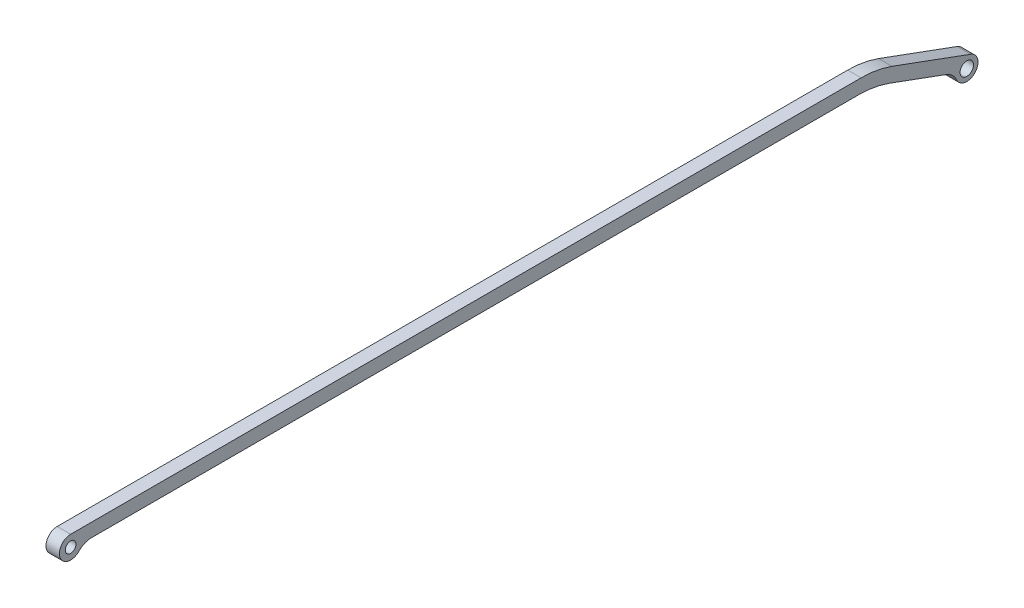
ISO-10303-21;
HEADER;
FILE_DESCRIPTION(('STEP AP214'),'2;1');
FILE_NAME('part.step','',(''),(''),'','','');
FILE_SCHEMA(('AUTOMOTIVE_DESIGN { 1 0 10303 214 1 1 1 1 }'));
ENDSEC;
DATA;
#1=APPLICATION_CONTEXT('core data for automotive mechanical design processes');
#2=APPLICATION_PROTOCOL_DEFINITION('international standard','automotive_design',2000,#1);
#3=PRODUCT_CONTEXT('',#1,'mechanical');
#4=PRODUCT('Part','Part','',(#3));
#5=PRODUCT_RELATED_PRODUCT_CATEGORY('part','',(#4));
#6=PRODUCT_DEFINITION_FORMATION('','',#4);
#7=PRODUCT_DEFINITION_CONTEXT('part definition',#1,'design');
#8=PRODUCT_DEFINITION('design','',#6,#7);
#9=PRODUCT_DEFINITION_SHAPE('','',#8);
#10=(LENGTH_UNIT() NAMED_UNIT(*) SI_UNIT(.MILLI.,.METRE.));
#11=(NAMED_UNIT(*) PLANE_ANGLE_UNIT() SI_UNIT($,.RADIAN.));
#12=(NAMED_UNIT(*) SI_UNIT($,.STERADIAN.) SOLID_ANGLE_UNIT());
#13=UNCERTAINTY_MEASURE_WITH_UNIT(LENGTH_MEASURE(1.E-05),#10,'distance_accuracy_value','');
#14=(GEOMETRIC_REPRESENTATION_CONTEXT(3) GLOBAL_UNCERTAINTY_ASSIGNED_CONTEXT((#13)) GLOBAL_UNIT_ASSIGNED_CONTEXT((#10,
#11,#12)) REPRESENTATION_CONTEXT('',''));
#15=CARTESIAN_POINT('',(0.,0.,0.));
#16=DIRECTION('',(0.,0.,1.));
#17=DIRECTION('',(1.,0.,0.));
#18=AXIS2_PLACEMENT_3D('',#15,#16,#17);
#19=CARTESIAN_POINT('',(1.5,-0.25,99.9296627633657));
#20=DIRECTION('',(1.,0.,0.));
#21=DIRECTION('',(0.,0.,-1.));
#22=AXIS2_PLACEMENT_3D('',#19,#20,#21);
#23=PLANE('',#22);
#24=CARTESIAN_POINT('',(1.5,-0.25,99.9296627633657));
#25=DIRECTION('',(1.,0.,0.));
#26=DIRECTION('',(0.,0.,-1.));
#27=AXIS2_PLACEMENT_3D('',#24,#25,#26);
#28=CIRCLE('',#27,0.600000000000007);
#29=CARTESIAN_POINT('',(1.5,-0.25,99.3296627633657));
#30=VERTEX_POINT('',#29);
#31=EDGE_CURVE('E146',#30,#30,#28,.T.);
#32=ORIENTED_EDGE('',*,*,#31,.F.);
#33=EDGE_LOOP('',(#32));
#34=FACE_BOUND('',#33,.T.);
#35=CARTESIAN_POINT('',(1.5,-0.25,99.9296627633657));
#36=DIRECTION('',(1.,0.,0.));
#37=DIRECTION('',(0.,0.,-1.));
#38=AXIS2_PLACEMENT_3D('',#35,#36,#37);
#39=CIRCLE('',#38,1.25);
#40=CARTESIAN_POINT('',(1.5,1.,99.9296627633657));
#41=VERTEX_POINT('',#40);
#42=CARTESIAN_POINT('',(1.5,-1.11538461538462,99.0276597326304));
#43=VERTEX_POINT('',#42);
#44=EDGE_CURVE('E161',#41,#43,#39,.T.);
#45=ORIENTED_EDGE('',*,*,#44,.T.);
#46=CARTESIAN_POINT('',(1.5,-2.5,97.584454883454));
#47=DIRECTION('',(-1.,0.,0.));
#48=DIRECTION('',(0.,0.,1.));
#49=AXIS2_PLACEMENT_3D('',#46,#47,#48);
#50=CIRCLE('',#49,2.);
#51=CARTESIAN_POINT('',(1.5,-0.5,97.584454883454));
#52=VERTEX_POINT('',#51);
#53=EDGE_CURVE('E99',#43,#52,#50,.T.);
#54=ORIENTED_EDGE('',*,*,#53,.T.);
#55=DIRECTION('',(0.,0.,-1.));
#56=VECTOR('',#55,1.);
#57=CARTESIAN_POINT('',(1.5,-0.5,97.584454883454));
#58=LINE('',#57,#56);
#59=CARTESIAN_POINT('',(1.5,-0.499999999999999,12.0428471598259));
#60=VERTEX_POINT('',#59);
#61=EDGE_CURVE('E182',#52,#60,#58,.T.);
#62=ORIENTED_EDGE('',*,*,#61,.T.);
#63=CARTESIAN_POINT('',(1.5,-10.5,12.0428471598259));
#64=DIRECTION('',(-1.,0.,0.));
#65=DIRECTION('',(0.,0.,-1.));
#66=AXIS2_PLACEMENT_3D('',#63,#64,#65);
#67=CIRCLE('',#66,10.);
#68=CARTESIAN_POINT('',(1.5,-1.11180558268441,8.59874995116809));
#69=VERTEX_POINT('',#68);
#70=EDGE_CURVE('E201',#60,#69,#67,.T.);
#71=ORIENTED_EDGE('',*,*,#70,.T.);
#72=DIRECTION('',(0.,-0.344409720865779,-0.938819441731559));
#73=VECTOR('',#72,1.);
#74=CARTESIAN_POINT('',(1.5,-3.42699246914028,2.28782918277961));
#75=LINE('',#74,#73);
#76=CARTESIAN_POINT('',(1.5,-3.42699246914028,2.28782918277961));
#77=VERTEX_POINT('',#76);
#78=EDGE_CURVE('E198',#69,#77,#75,.T.);
#79=ORIENTED_EDGE('',*,*,#78,.T.);
#80=CARTESIAN_POINT('',(1.5,-5.3046313526034,2.97664862451117));
#81=DIRECTION('',(-1.,0.,0.));
#82=DIRECTION('',(0.,0.,-1.));
#83=AXIS2_PLACEMENT_3D('',#80,#81,#82);
#84=CIRCLE('',#83,2.);
#85=CARTESIAN_POINT('',(1.5,-4.50178128946284,1.14486485558122));
#86=VERTEX_POINT('',#85);
#87=EDGE_CURVE('E200',#77,#86,#84,.T.);
#88=ORIENTED_EDGE('',*,*,#87,.T.);
#89=CARTESIAN_POINT('',(1.5,-4.,0.));
#90=DIRECTION('',(1.,0.,0.));
#91=DIRECTION('',(0.,0.,-1.));
#92=AXIS2_PLACEMENT_3D('',#89,#90,#91);
#93=CIRCLE('',#92,1.25);
#94=CARTESIAN_POINT('',(1.5,-2.82647569783555,-0.430512151082224));
#95=VERTEX_POINT('',#94);
#96=EDGE_CURVE('E124',#86,#95,#93,.T.);
#97=ORIENTED_EDGE('',*,*,#96,.T.);
#98=DIRECTION('',(0.,0.34440972086578,0.938819441731559));
#99=VECTOR('',#98,1.);
#100=CARTESIAN_POINT('',(1.5,0.38819441731559,8.33229162597338));
#101=LINE('',#100,#99);
#102=CARTESIAN_POINT('',(1.5,0.38819441731559,8.33229162597338));
#103=VERTEX_POINT('',#102);
#104=EDGE_CURVE('E118',#95,#103,#101,.T.);
#105=ORIENTED_EDGE('',*,*,#104,.T.);
#106=CARTESIAN_POINT('',(1.5,-9.,11.7763888346312));
#107=DIRECTION('',(1.,0.,0.));
#108=DIRECTION('',(0.,0.,-1.));
#109=AXIS2_PLACEMENT_3D('',#106,#107,#108);
#110=CIRCLE('',#109,10.);
#111=CARTESIAN_POINT('',(1.5,0.999999999999999,11.7763888346312));
#112=VERTEX_POINT('',#111);
#113=EDGE_CURVE('E122',#103,#112,#110,.T.);
#114=ORIENTED_EDGE('',*,*,#113,.T.);
#115=DIRECTION('',(0.,0.,1.));
#116=VECTOR('',#115,1.);
#117=CARTESIAN_POINT('',(1.5,1.,99.9296627633657));
#118=LINE('',#117,#116);
#119=EDGE_CURVE('E50',#112,#41,#118,.T.);
#120=ORIENTED_EDGE('',*,*,#119,.T.);
#121=EDGE_LOOP('',(#45,#54,#62,#71,#79,#88,#97,#105,#114,#120));
#122=FACE_BOUND('',#121,.T.);
#123=CARTESIAN_POINT('',(1.5,-4.,0.));
#124=DIRECTION('',(1.,0.,0.));
#125=DIRECTION('',(0.,0.,-1.));
#126=AXIS2_PLACEMENT_3D('',#123,#124,#125);
#127=CIRCLE('',#126,0.750000000000002);
#128=CARTESIAN_POINT('',(1.5,-4.,-0.750000000000002));
#129=VERTEX_POINT('',#128);
#130=EDGE_CURVE('E212',#129,#129,#127,.T.);
#131=ORIENTED_EDGE('',*,*,#130,.F.);
#132=EDGE_LOOP('',(#131));
#133=FACE_BOUND('',#132,.T.);
#134=ADVANCED_FACE('F33',(#34,#122,#133),#23,.T.);
#135=CARTESIAN_POINT('',(0.,-0.25,99.9296627633657));
#136=DIRECTION('',(1.,0.,0.));
#137=DIRECTION('',(0.,0.,-1.));
#138=AXIS2_PLACEMENT_3D('',#135,#136,#137);
#139=PLANE('',#138);
#140=CARTESIAN_POINT('',(0.,-0.25,99.9296627633657));
#141=DIRECTION('',(1.,0.,0.));
#142=DIRECTION('',(0.,0.,-1.));
#143=AXIS2_PLACEMENT_3D('',#140,#141,#142);
#144=CIRCLE('',#143,0.600000000000007);
#145=CARTESIAN_POINT('',(0.,-0.25,99.3296627633657));
#146=VERTEX_POINT('',#145);
#147=EDGE_CURVE('E209',#146,#146,#144,.T.);
#148=ORIENTED_EDGE('',*,*,#147,.T.);
#149=EDGE_LOOP('',(#148));
#150=FACE_BOUND('',#149,.T.);
#151=CARTESIAN_POINT('',(0.,-0.25,99.9296627633657));
#152=DIRECTION('',(1.,0.,0.));
#153=DIRECTION('',(0.,0.,-1.));
#154=AXIS2_PLACEMENT_3D('',#151,#152,#153);
#155=CIRCLE('',#154,1.25);
#156=CARTESIAN_POINT('',(0.,1.,99.9296627633657));
#157=VERTEX_POINT('',#156);
#158=CARTESIAN_POINT('',(0.,-1.11538461538462,99.0276597326304));
#159=VERTEX_POINT('',#158);
#160=EDGE_CURVE('E142',#157,#159,#155,.T.);
#161=ORIENTED_EDGE('',*,*,#160,.F.);
#162=DIRECTION('',(0.,0.,1.));
#163=VECTOR('',#162,1.);
#164=CARTESIAN_POINT('',(0.,1.,99.9296627633657));
#165=LINE('',#164,#163);
#166=CARTESIAN_POINT('',(0.,0.999999999999999,11.7763888346312));
#167=VERTEX_POINT('',#166);
#168=EDGE_CURVE('E91',#167,#157,#165,.T.);
#169=ORIENTED_EDGE('',*,*,#168,.F.);
#170=CARTESIAN_POINT('',(0.,-9.,11.7763888346312));
#171=DIRECTION('',(1.,0.,0.));
#172=DIRECTION('',(0.,0.,-1.));
#173=AXIS2_PLACEMENT_3D('',#170,#171,#172);
#174=CIRCLE('',#173,10.);
#175=CARTESIAN_POINT('',(0.,0.38819441731559,8.33229162597338));
#176=VERTEX_POINT('',#175);
#177=EDGE_CURVE('E85',#176,#167,#174,.T.);
#178=ORIENTED_EDGE('',*,*,#177,.F.);
#179=DIRECTION('',(0.,0.34440972086578,0.938819441731559));
#180=VECTOR('',#179,1.);
#181=CARTESIAN_POINT('',(0.,0.38819441731559,8.33229162597338));
#182=LINE('',#181,#180);
#183=CARTESIAN_POINT('',(0.,-2.82647569783555,-0.430512151082224));
#184=VERTEX_POINT('',#183);
#185=EDGE_CURVE('E132',#184,#176,#182,.T.);
#186=ORIENTED_EDGE('',*,*,#185,.F.);
#187=CARTESIAN_POINT('',(0.,-4.,0.));
#188=DIRECTION('',(1.,0.,0.));
#189=DIRECTION('',(0.,0.,-1.));
#190=AXIS2_PLACEMENT_3D('',#187,#188,#189);
#191=CIRCLE('',#190,1.25);
#192=CARTESIAN_POINT('',(0.,-4.50178128946284,1.14486485558122));
#193=VERTEX_POINT('',#192);
#194=EDGE_CURVE('E156',#193,#184,#191,.T.);
#195=ORIENTED_EDGE('',*,*,#194,.F.);
#196=CARTESIAN_POINT('',(0.,-5.3046313526034,2.97664862451117));
#197=DIRECTION('',(-1.,0.,0.));
#198=DIRECTION('',(0.,0.,-1.));
#199=AXIS2_PLACEMENT_3D('',#196,#197,#198);
#200=CIRCLE('',#199,2.);
#201=CARTESIAN_POINT('',(0.,-3.42699246914028,2.28782918277961));
#202=VERTEX_POINT('',#201);
#203=EDGE_CURVE('E154',#202,#193,#200,.T.);
#204=ORIENTED_EDGE('',*,*,#203,.F.);
#205=DIRECTION('',(0.,-0.344409720865779,-0.938819441731559));
#206=VECTOR('',#205,1.);
#207=CARTESIAN_POINT('',(0.,-3.42699246914028,2.28782918277961));
#208=LINE('',#207,#206);
#209=CARTESIAN_POINT('',(0.,-1.11180558268441,8.59874995116809));
#210=VERTEX_POINT('',#209);
#211=EDGE_CURVE('E152',#210,#202,#208,.T.);
#212=ORIENTED_EDGE('',*,*,#211,.F.);
#213=CARTESIAN_POINT('',(0.,-10.5,12.0428471598259));
#214=DIRECTION('',(-1.,0.,0.));
#215=DIRECTION('',(0.,0.,-1.));
#216=AXIS2_PLACEMENT_3D('',#213,#214,#215);
#217=CIRCLE('',#216,10.);
#218=CARTESIAN_POINT('',(0.,-0.499999999999999,12.0428471598259));
#219=VERTEX_POINT('',#218);
#220=EDGE_CURVE('E150',#219,#210,#217,.T.);
#221=ORIENTED_EDGE('',*,*,#220,.F.);
#222=DIRECTION('',(0.,0.,-1.));
#223=VECTOR('',#222,1.);
#224=CARTESIAN_POINT('',(0.,-0.5,97.584454883454));
#225=LINE('',#224,#223);
#226=CARTESIAN_POINT('',(0.,-0.5,97.584454883454));
#227=VERTEX_POINT('',#226);
#228=EDGE_CURVE('E148',#227,#219,#225,.T.);
#229=ORIENTED_EDGE('',*,*,#228,.F.);
#230=CARTESIAN_POINT('',(0.,-2.5,97.584454883454));
#231=DIRECTION('',(-1.,0.,0.));
#232=DIRECTION('',(0.,0.,1.));
#233=AXIS2_PLACEMENT_3D('',#230,#231,#232);
#234=CIRCLE('',#233,2.);
#235=EDGE_CURVE('E145',#159,#227,#234,.T.);
#236=ORIENTED_EDGE('',*,*,#235,.F.);
#237=EDGE_LOOP('',(#161,#169,#178,#186,#195,#204,#212,#221,#229,#236));
#238=FACE_BOUND('',#237,.T.);
#239=CARTESIAN_POINT('',(0.,-4.,0.));
#240=DIRECTION('',(1.,0.,0.));
#241=DIRECTION('',(0.,0.,-1.));
#242=AXIS2_PLACEMENT_3D('',#239,#240,#241);
#243=CIRCLE('',#242,0.750000000000002);
#244=CARTESIAN_POINT('',(0.,-4.,-0.750000000000002));
#245=VERTEX_POINT('',#244);
#246=EDGE_CURVE('E215',#245,#245,#243,.T.);
#247=ORIENTED_EDGE('',*,*,#246,.T.);
#248=EDGE_LOOP('',(#247));
#249=FACE_BOUND('',#248,.T.);
#250=ADVANCED_FACE('F186',(#150,#238,#249),#139,.F.);
#251=CARTESIAN_POINT('',(1.5,-0.25,99.9296627633657));
#252=DIRECTION('',(-1.,0.,0.));
#253=DIRECTION('',(0.,0.,1.));
#254=AXIS2_PLACEMENT_3D('',#251,#252,#253);
#255=CYLINDRICAL_SURFACE('',#254,1.25);
#256=ORIENTED_EDGE('',*,*,#160,.T.);
#257=DIRECTION('',(-1.,0.,0.));
#258=VECTOR('',#257,1.);
#259=CARTESIAN_POINT('',(1.5,-1.11538461538462,99.0276597326304));
#260=LINE('',#259,#258);
#261=EDGE_CURVE('E11',#43,#159,#260,.T.);
#262=ORIENTED_EDGE('',*,*,#261,.F.);
#263=ORIENTED_EDGE('',*,*,#44,.F.);
#264=DIRECTION('',(-1.,0.,0.));
#265=VECTOR('',#264,1.);
#266=CARTESIAN_POINT('',(1.5,1.,99.9296627633657));
#267=LINE('',#266,#265);
#268=EDGE_CURVE('E138',#41,#157,#267,.T.);
#269=ORIENTED_EDGE('',*,*,#268,.T.);
#270=EDGE_LOOP('',(#256,#262,#263,#269));
#271=FACE_BOUND('',#270,.T.);
#272=ADVANCED_FACE('F35',(#271),#255,.T.);
#273=CARTESIAN_POINT('',(1.5,-2.5,97.584454883454));
#274=DIRECTION('',(-1.,0.,0.));
#275=DIRECTION('',(0.,0.,1.));
#276=AXIS2_PLACEMENT_3D('',#273,#274,#275);
#277=CYLINDRICAL_SURFACE('',#276,2.);
#278=ORIENTED_EDGE('',*,*,#235,.T.);
#279=DIRECTION('',(-1.,0.,0.));
#280=VECTOR('',#279,1.);
#281=CARTESIAN_POINT('',(1.5,-0.5,97.584454883454));
#282=LINE('',#281,#280);
#283=EDGE_CURVE('E42',#52,#227,#282,.T.);
#284=ORIENTED_EDGE('',*,*,#283,.F.);
#285=ORIENTED_EDGE('',*,*,#53,.F.);
#286=ORIENTED_EDGE('',*,*,#261,.T.);
#287=EDGE_LOOP('',(#278,#284,#285,#286));
#288=FACE_BOUND('',#287,.T.);
#289=ADVANCED_FACE('F256',(#288),#277,.F.);
#290=CARTESIAN_POINT('',(1.5,-0.5,97.584454883454));
#291=DIRECTION('',(0.,1.,0.));
#292=DIRECTION('',(0.,0.,1.));
#293=AXIS2_PLACEMENT_3D('',#290,#291,#292);
#294=PLANE('',#293);
#295=ORIENTED_EDGE('',*,*,#228,.T.);
#296=DIRECTION('',(-1.,0.,0.));
#297=VECTOR('',#296,1.);
#298=CARTESIAN_POINT('',(1.5,-0.499999999999999,12.0428471598259));
#299=LINE('',#298,#297);
#300=EDGE_CURVE('E174',#60,#219,#299,.T.);
#301=ORIENTED_EDGE('',*,*,#300,.F.);
#302=ORIENTED_EDGE('',*,*,#61,.F.);
#303=ORIENTED_EDGE('',*,*,#283,.T.);
#304=EDGE_LOOP('',(#295,#301,#302,#303));
#305=FACE_BOUND('',#304,.T.);
#306=ADVANCED_FACE('F180',(#305),#294,.F.);
#307=CARTESIAN_POINT('',(1.5,-10.5,12.0428471598259));
#308=DIRECTION('',(-1.,0.,0.));
#309=DIRECTION('',(0.,0.,1.));
#310=AXIS2_PLACEMENT_3D('',#307,#308,#309);
#311=CYLINDRICAL_SURFACE('',#310,10.);
#312=ORIENTED_EDGE('',*,*,#220,.T.);
#313=DIRECTION('',(-1.,0.,0.));
#314=VECTOR('',#313,1.);
#315=CARTESIAN_POINT('',(1.5,-1.11180558268441,8.59874995116809));
#316=LINE('',#315,#314);
#317=EDGE_CURVE('E171',#69,#210,#316,.T.);
#318=ORIENTED_EDGE('',*,*,#317,.F.);
#319=ORIENTED_EDGE('',*,*,#70,.F.);
#320=ORIENTED_EDGE('',*,*,#300,.T.);
#321=EDGE_LOOP('',(#312,#318,#319,#320));
#322=FACE_BOUND('',#321,.T.);
#323=ADVANCED_FACE('F192',(#322),#311,.F.);
#324=CARTESIAN_POINT('',(1.5,-3.42699246914028,2.28782918277961));
#325=DIRECTION('',(0.,0.938819441731559,-0.344409720865779));
#326=DIRECTION('',(0.,0.344409720865779,0.938819441731559));
#327=AXIS2_PLACEMENT_3D('',#324,#325,#326);
#328=PLANE('',#327);
#329=ORIENTED_EDGE('',*,*,#211,.T.);
#330=DIRECTION('',(-1.,0.,0.));
#331=VECTOR('',#330,1.);
#332=CARTESIAN_POINT('',(1.5,-3.42699246914028,2.28782918277961));
#333=LINE('',#332,#331);
#334=EDGE_CURVE('E168',#77,#202,#333,.T.);
#335=ORIENTED_EDGE('',*,*,#334,.F.);
#336=ORIENTED_EDGE('',*,*,#78,.F.);
#337=ORIENTED_EDGE('',*,*,#317,.T.);
#338=EDGE_LOOP('',(#329,#335,#336,#337));
#339=FACE_BOUND('',#338,.T.);
#340=ADVANCED_FACE('F196',(#339),#328,.F.);
#341=CARTESIAN_POINT('',(1.5,-5.3046313526034,2.97664862451117));
#342=DIRECTION('',(-1.,0.,0.));
#343=DIRECTION('',(0.,0.,1.));
#344=AXIS2_PLACEMENT_3D('',#341,#342,#343);
#345=CYLINDRICAL_SURFACE('',#344,2.);
#346=ORIENTED_EDGE('',*,*,#203,.T.);
#347=DIRECTION('',(-1.,0.,0.));
#348=VECTOR('',#347,1.);
#349=CARTESIAN_POINT('',(1.5,-4.50178128946284,1.14486485558122));
#350=LINE('',#349,#348);
#351=EDGE_CURVE('E165',#86,#193,#350,.T.);
#352=ORIENTED_EDGE('',*,*,#351,.F.);
#353=ORIENTED_EDGE('',*,*,#87,.F.);
#354=ORIENTED_EDGE('',*,*,#334,.T.);
#355=EDGE_LOOP('',(#346,#352,#353,#354));
#356=FACE_BOUND('',#355,.T.);
#357=ADVANCED_FACE('F246',(#356),#345,.F.);
#358=CARTESIAN_POINT('',(1.5,-4.,0.));
#359=DIRECTION('',(-1.,0.,0.));
#360=DIRECTION('',(0.,0.,1.));
#361=AXIS2_PLACEMENT_3D('',#358,#359,#360);
#362=CYLINDRICAL_SURFACE('',#361,1.25);
#363=ORIENTED_EDGE('',*,*,#194,.T.);
#364=DIRECTION('',(-1.,0.,0.));
#365=VECTOR('',#364,1.);
#366=CARTESIAN_POINT('',(1.5,-2.82647569783555,-0.430512151082224));
#367=LINE('',#366,#365);
#368=EDGE_CURVE('E133',#95,#184,#367,.T.);
#369=ORIENTED_EDGE('',*,*,#368,.F.);
#370=ORIENTED_EDGE('',*,*,#96,.F.);
#371=ORIENTED_EDGE('',*,*,#351,.T.);
#372=EDGE_LOOP('',(#363,#369,#370,#371));
#373=FACE_BOUND('',#372,.T.);
#374=ADVANCED_FACE('F243',(#373),#362,.T.);
#375=CARTESIAN_POINT('',(1.5,0.38819441731559,8.33229162597338));
#376=DIRECTION('',(0.,-0.938819441731559,0.34440972086578));
#377=DIRECTION('',(0.,-0.34440972086578,-0.938819441731559));
#378=AXIS2_PLACEMENT_3D('',#375,#376,#377);
#379=PLANE('',#378);
#380=ORIENTED_EDGE('',*,*,#185,.T.);
#381=DIRECTION('',(-1.,0.,0.));
#382=VECTOR('',#381,1.);
#383=CARTESIAN_POINT('',(1.5,0.38819441731559,8.33229162597338));
#384=LINE('',#383,#382);
#385=EDGE_CURVE('E129',#103,#176,#384,.T.);
#386=ORIENTED_EDGE('',*,*,#385,.F.);
#387=ORIENTED_EDGE('',*,*,#104,.F.);
#388=ORIENTED_EDGE('',*,*,#368,.T.);
#389=EDGE_LOOP('',(#380,#386,#387,#388));
#390=FACE_BOUND('',#389,.T.);
#391=ADVANCED_FACE('F130',(#390),#379,.F.);
#392=CARTESIAN_POINT('',(1.5,-9.,11.7763888346312));
#393=DIRECTION('',(-1.,0.,0.));
#394=DIRECTION('',(0.,0.,1.));
#395=AXIS2_PLACEMENT_3D('',#392,#393,#394);
#396=CYLINDRICAL_SURFACE('',#395,10.);
#397=ORIENTED_EDGE('',*,*,#177,.T.);
#398=DIRECTION('',(-1.,0.,0.));
#399=VECTOR('',#398,1.);
#400=CARTESIAN_POINT('',(1.5,0.999999999999999,11.7763888346312));
#401=LINE('',#400,#399);
#402=EDGE_CURVE('E134',#112,#167,#401,.T.);
#403=ORIENTED_EDGE('',*,*,#402,.F.);
#404=ORIENTED_EDGE('',*,*,#113,.F.);
#405=ORIENTED_EDGE('',*,*,#385,.T.);
#406=EDGE_LOOP('',(#397,#403,#404,#405));
#407=FACE_BOUND('',#406,.T.);
#408=ADVANCED_FACE('F136',(#407),#396,.T.);
#409=CARTESIAN_POINT('',(1.5,1.,99.9296627633657));
#410=DIRECTION('',(0.,-1.,0.));
#411=DIRECTION('',(0.,0.,-1.));
#412=AXIS2_PLACEMENT_3D('',#409,#410,#411);
#413=PLANE('',#412);
#414=ORIENTED_EDGE('',*,*,#168,.T.);
#415=ORIENTED_EDGE('',*,*,#268,.F.);
#416=ORIENTED_EDGE('',*,*,#119,.F.);
#417=ORIENTED_EDGE('',*,*,#402,.T.);
#418=EDGE_LOOP('',(#414,#415,#416,#417));
#419=FACE_BOUND('',#418,.T.);
#420=ADVANCED_FACE('F236',(#419),#413,.F.);
#421=CARTESIAN_POINT('',(1.5,-0.25,99.9296627633657));
#422=DIRECTION('',(-1.,0.,0.));
#423=DIRECTION('',(0.,0.,1.));
#424=AXIS2_PLACEMENT_3D('',#421,#422,#423);
#425=CYLINDRICAL_SURFACE('',#424,0.600000000000007);
#426=ORIENTED_EDGE('',*,*,#31,.T.);
#427=EDGE_LOOP('',(#426));
#428=FACE_BOUND('',#427,.T.);
#429=ORIENTED_EDGE('',*,*,#147,.F.);
#430=EDGE_LOOP('',(#429));
#431=FACE_BOUND('',#430,.T.);
#432=ADVANCED_FACE('F233',(#428,#431),#425,.F.);
#433=CARTESIAN_POINT('',(1.5,-4.,0.));
#434=DIRECTION('',(-1.,0.,0.));
#435=DIRECTION('',(0.,0.,1.));
#436=AXIS2_PLACEMENT_3D('',#433,#434,#435);
#437=CYLINDRICAL_SURFACE('',#436,0.750000000000002);
#438=ORIENTED_EDGE('',*,*,#130,.T.);
#439=EDGE_LOOP('',(#438));
#440=FACE_BOUND('',#439,.T.);
#441=ORIENTED_EDGE('',*,*,#246,.F.);
#442=EDGE_LOOP('',(#441));
#443=FACE_BOUND('',#442,.T.);
#444=ADVANCED_FACE('F221',(#440,#443),#437,.F.);
#445=CLOSED_SHELL('',(#134,#250,#272,#289,#306,#323,#340,#357,#374,#391,#408,#420,#432,#444));
#446=MANIFOLD_SOLID_BREP('B2',#445);
#447=ADVANCED_BREP_SHAPE_REPRESENTATION('',(#18,#446),#14);
#448=SHAPE_DEFINITION_REPRESENTATION(#9,#447);
ENDSEC;
END-ISO-10303-21;
